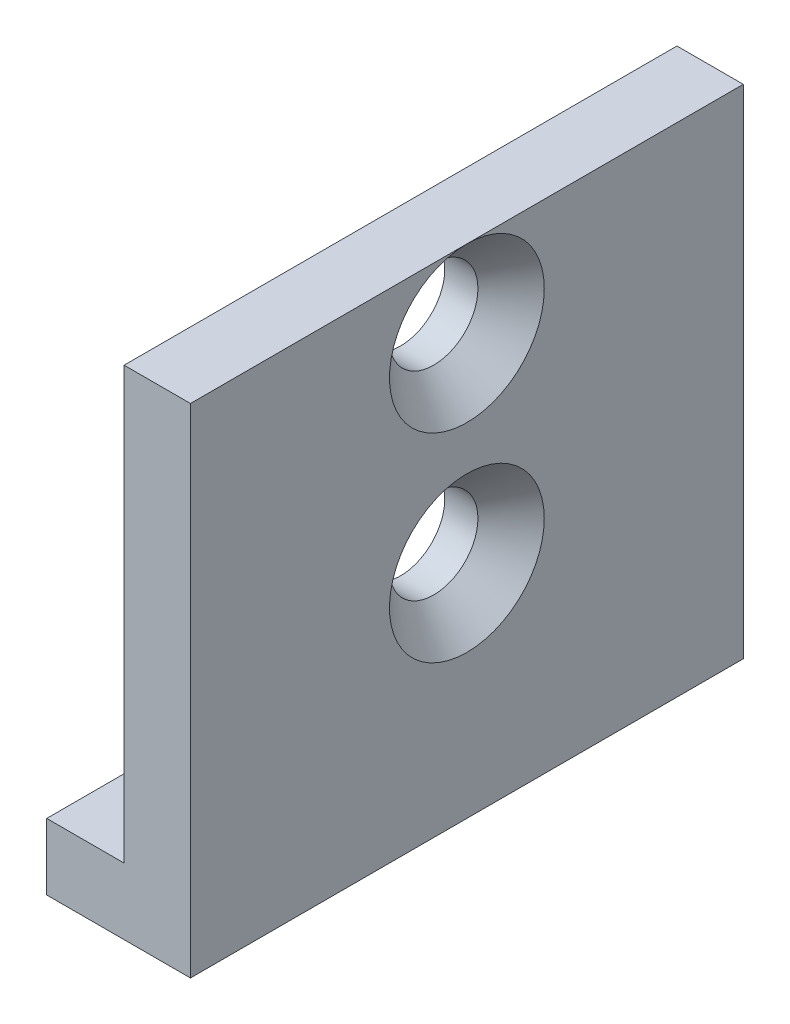
ISO-10303-21;
HEADER;
FILE_DESCRIPTION(('STEP AP214'),'2;1');
FILE_NAME('part.step','',(''),(''),'','','');
FILE_SCHEMA(('AUTOMOTIVE_DESIGN { 1 0 10303 214 1 1 1 1 }'));
ENDSEC;
DATA;
#1=APPLICATION_CONTEXT('core data for automotive mechanical design processes');
#2=APPLICATION_PROTOCOL_DEFINITION('international standard','automotive_design',2000,#1);
#3=PRODUCT_CONTEXT('',#1,'mechanical');
#4=PRODUCT('Part','Part','',(#3));
#5=PRODUCT_RELATED_PRODUCT_CATEGORY('part','',(#4));
#6=PRODUCT_DEFINITION_FORMATION('','',#4);
#7=PRODUCT_DEFINITION_CONTEXT('part definition',#1,'design');
#8=PRODUCT_DEFINITION('design','',#6,#7);
#9=PRODUCT_DEFINITION_SHAPE('','',#8);
#10=(LENGTH_UNIT() NAMED_UNIT(*) SI_UNIT(.MILLI.,.METRE.));
#11=(NAMED_UNIT(*) PLANE_ANGLE_UNIT() SI_UNIT($,.RADIAN.));
#12=(NAMED_UNIT(*) SI_UNIT($,.STERADIAN.) SOLID_ANGLE_UNIT());
#13=UNCERTAINTY_MEASURE_WITH_UNIT(LENGTH_MEASURE(1.E-05),#10,'distance_accuracy_value','');
#14=(GEOMETRIC_REPRESENTATION_CONTEXT(3) GLOBAL_UNCERTAINTY_ASSIGNED_CONTEXT((#13)) GLOBAL_UNIT_ASSIGNED_CONTEXT((#10,
#11,#12)) REPRESENTATION_CONTEXT('',''));
#15=CARTESIAN_POINT('',(0.,0.,0.));
#16=DIRECTION('',(0.,0.,1.));
#17=DIRECTION('',(1.,0.,0.));
#18=AXIS2_PLACEMENT_3D('',#15,#16,#17);
#19=CARTESIAN_POINT('',(-72.3656035851153,18.3861494768777,25.));
#20=DIRECTION('',(0.,1.,0.));
#21=DIRECTION('',(0.,0.,1.));
#22=AXIS2_PLACEMENT_3D('',#19,#20,#21);
#23=PLANE('',#22);
#24=DIRECTION('',(1.,0.,0.));
#25=VECTOR('',#24,1.);
#26=CARTESIAN_POINT('',(-72.3656035851153,18.3861494768777,-25.));
#27=LINE('',#26,#25);
#28=CARTESIAN_POINT('',(-72.3656035851153,18.3861494768777,-25.));
#29=VERTEX_POINT('',#28);
#30=CARTESIAN_POINT('',(-59.3656035851153,18.3861494768777,-25.));
#31=VERTEX_POINT('',#30);
#32=EDGE_CURVE('E139',#29,#31,#27,.T.);
#33=ORIENTED_EDGE('',*,*,#32,.T.);
#34=DIRECTION('',(0.,0.,-1.));
#35=VECTOR('',#34,1.);
#36=CARTESIAN_POINT('',(-59.3656035851153,18.3861494768777,25.));
#37=LINE('',#36,#35);
#38=CARTESIAN_POINT('',(-59.3656035851153,18.3861494768777,25.));
#39=VERTEX_POINT('',#38);
#40=EDGE_CURVE('E170',#39,#31,#37,.T.);
#41=ORIENTED_EDGE('',*,*,#40,.F.);
#42=DIRECTION('',(1.,0.,0.));
#43=VECTOR('',#42,1.);
#44=CARTESIAN_POINT('',(-72.3656035851153,18.3861494768777,25.));
#45=LINE('',#44,#43);
#46=CARTESIAN_POINT('',(-72.3656035851153,18.3861494768777,25.));
#47=VERTEX_POINT('',#46);
#48=EDGE_CURVE('E158',#47,#39,#45,.T.);
#49=ORIENTED_EDGE('',*,*,#48,.F.);
#50=DIRECTION('',(0.,0.,-1.));
#51=VECTOR('',#50,1.);
#52=CARTESIAN_POINT('',(-72.3656035851153,18.3861494768777,25.));
#53=LINE('',#52,#51);
#54=EDGE_CURVE('E135',#47,#29,#53,.T.);
#55=ORIENTED_EDGE('',*,*,#54,.T.);
#56=EDGE_LOOP('',(#33,#41,#49,#55));
#57=FACE_BOUND('',#56,.T.);
#58=ADVANCED_FACE('F43',(#57),#23,.F.);
#59=CARTESIAN_POINT('',(-59.3656035851153,18.3861494768777,25.));
#60=DIRECTION('',(-1.,0.,0.));
#61=DIRECTION('',(0.,-1.,0.));
#62=AXIS2_PLACEMENT_3D('',#59,#60,#61);
#63=PLANE('',#62);
#64=CARTESIAN_POINT('',(-59.3656035851153,38.3861494768777,0.));
#65=DIRECTION('',(-1.,0.,0.));
#66=DIRECTION('',(0.,-1.,0.));
#67=AXIS2_PLACEMENT_3D('',#64,#65,#66);
#68=CIRCLE('',#67,7.00000000000001);
#69=CARTESIAN_POINT('',(-59.3656035851153,31.3861494768777,0.));
#70=VERTEX_POINT('',#69);
#71=EDGE_CURVE('E177',#70,#70,#68,.T.);
#72=ORIENTED_EDGE('',*,*,#71,.T.);
#73=EDGE_LOOP('',(#72));
#74=FACE_BOUND('',#73,.T.);
#75=DIRECTION('',(0.,0.,-1.));
#76=VECTOR('',#75,1.);
#77=CARTESIAN_POINT('',(-59.3656035851153,63.3861494768777,25.));
#78=LINE('',#77,#76);
#79=CARTESIAN_POINT('',(-59.3656035851153,63.3861494768777,0.));
#80=VERTEX_POINT('',#79);
#81=CARTESIAN_POINT('',(-59.3656035851153,63.3861494768777,-25.));
#82=VERTEX_POINT('',#81);
#83=EDGE_CURVE('E165',#80,#82,#78,.T.);
#84=ORIENTED_EDGE('',*,*,#83,.F.);
#85=CARTESIAN_POINT('',(-59.3656035851153,56.3861494768777,0.));
#86=DIRECTION('',(-1.,0.,0.));
#87=DIRECTION('',(0.,-1.,0.));
#88=AXIS2_PLACEMENT_3D('',#85,#86,#87);
#89=CIRCLE('',#88,7.00000000000001);
#90=EDGE_CURVE('E53',#80,#80,#89,.T.);
#91=ORIENTED_EDGE('',*,*,#90,.T.);
#92=CARTESIAN_POINT('',(-59.3656035851153,63.3861494768777,25.));
#93=VERTEX_POINT('',#92);
#94=EDGE_CURVE('E166',#93,#80,#78,.T.);
#95=ORIENTED_EDGE('',*,*,#94,.F.);
#96=DIRECTION('',(0.,1.,0.));
#97=VECTOR('',#96,1.);
#98=CARTESIAN_POINT('',(-59.3656035851153,18.3861494768777,25.));
#99=LINE('',#98,#97);
#100=EDGE_CURVE('E100',#39,#93,#99,.T.);
#101=ORIENTED_EDGE('',*,*,#100,.F.);
#102=ORIENTED_EDGE('',*,*,#40,.T.);
#103=DIRECTION('',(0.,1.,0.));
#104=VECTOR('',#103,1.);
#105=CARTESIAN_POINT('',(-59.3656035851153,18.3861494768777,-25.));
#106=LINE('',#105,#104);
#107=EDGE_CURVE('E143',#31,#82,#106,.T.);
#108=ORIENTED_EDGE('',*,*,#107,.T.);
#109=EDGE_LOOP('',(#84,#91,#95,#101,#102,#108));
#110=FACE_BOUND('',#109,.T.);
#111=ADVANCED_FACE('F182',(#74,#110),#63,.F.);
#112=CARTESIAN_POINT('',(-59.3656035851153,63.3861494768777,25.));
#113=DIRECTION('',(0.,-1.,0.));
#114=DIRECTION('',(0.,0.,-1.));
#115=AXIS2_PLACEMENT_3D('',#112,#113,#114);
#116=PLANE('',#115);
#117=DIRECTION('',(-1.,0.,0.));
#118=VECTOR('',#117,1.);
#119=CARTESIAN_POINT('',(-59.3656035851153,63.3861494768777,-25.));
#120=LINE('',#119,#118);
#121=CARTESIAN_POINT('',(-65.3656035851153,63.3861494768777,-25.));
#122=VERTEX_POINT('',#121);
#123=EDGE_CURVE('E148',#82,#122,#120,.T.);
#124=ORIENTED_EDGE('',*,*,#123,.T.);
#125=DIRECTION('',(0.,0.,-1.));
#126=VECTOR('',#125,1.);
#127=CARTESIAN_POINT('',(-65.3656035851153,63.3861494768777,25.));
#128=LINE('',#127,#126);
#129=CARTESIAN_POINT('',(-65.3656035851153,63.3861494768777,25.));
#130=VERTEX_POINT('',#129);
#131=EDGE_CURVE('E128',#130,#122,#128,.T.);
#132=ORIENTED_EDGE('',*,*,#131,.F.);
#133=DIRECTION('',(-1.,0.,0.));
#134=VECTOR('',#133,1.);
#135=CARTESIAN_POINT('',(-59.3656035851153,63.3861494768777,25.));
#136=LINE('',#135,#134);
#137=EDGE_CURVE('E114',#93,#130,#136,.T.);
#138=ORIENTED_EDGE('',*,*,#137,.F.);
#139=ORIENTED_EDGE('',*,*,#94,.T.);
#140=ORIENTED_EDGE('',*,*,#83,.T.);
#141=EDGE_LOOP('',(#124,#132,#138,#139,#140));
#142=FACE_BOUND('',#141,.T.);
#143=ADVANCED_FACE('F186',(#142),#116,.F.);
#144=CARTESIAN_POINT('',(-65.3656035851153,63.3861494768777,25.));
#145=DIRECTION('',(1.,0.,0.));
#146=DIRECTION('',(0.,0.,-1.));
#147=AXIS2_PLACEMENT_3D('',#144,#145,#146);
#148=PLANE('',#147);
#149=CARTESIAN_POINT('',(-65.3656035851153,56.3861494768777,0.));
#150=DIRECTION('',(1.,0.,0.));
#151=DIRECTION('',(0.,0.,-1.));
#152=AXIS2_PLACEMENT_3D('',#149,#150,#151);
#153=CIRCLE('',#152,3.99999999999999);
#154=CARTESIAN_POINT('',(-65.3656035851153,56.3861494768777,-3.99999999999999));
#155=VERTEX_POINT('',#154);
#156=EDGE_CURVE('E196',#155,#155,#153,.T.);
#157=ORIENTED_EDGE('',*,*,#156,.T.);
#158=EDGE_LOOP('',(#157));
#159=FACE_BOUND('',#158,.T.);
#160=CARTESIAN_POINT('',(-65.3656035851153,38.3861494768777,0.));
#161=DIRECTION('',(1.,0.,0.));
#162=DIRECTION('',(0.,0.,-1.));
#163=AXIS2_PLACEMENT_3D('',#160,#161,#162);
#164=CIRCLE('',#163,3.99999999999999);
#165=CARTESIAN_POINT('',(-65.3656035851153,38.3861494768777,-3.99999999999999));
#166=VERTEX_POINT('',#165);
#167=EDGE_CURVE('E144',#166,#166,#164,.T.);
#168=ORIENTED_EDGE('',*,*,#167,.T.);
#169=EDGE_LOOP('',(#168));
#170=FACE_BOUND('',#169,.T.);
#171=DIRECTION('',(0.,-1.,0.));
#172=VECTOR('',#171,1.);
#173=CARTESIAN_POINT('',(-65.3656035851153,63.3861494768777,-25.));
#174=LINE('',#173,#172);
#175=CARTESIAN_POINT('',(-65.3656035851153,24.3861494768777,-25.));
#176=VERTEX_POINT('',#175);
#177=EDGE_CURVE('E124',#122,#176,#174,.T.);
#178=ORIENTED_EDGE('',*,*,#177,.T.);
#179=DIRECTION('',(0.,0.,-1.));
#180=VECTOR('',#179,1.);
#181=CARTESIAN_POINT('',(-65.3656035851153,24.3861494768777,25.));
#182=LINE('',#181,#180);
#183=CARTESIAN_POINT('',(-65.3656035851153,24.3861494768777,25.));
#184=VERTEX_POINT('',#183);
#185=EDGE_CURVE('E121',#184,#176,#182,.T.);
#186=ORIENTED_EDGE('',*,*,#185,.F.);
#187=DIRECTION('',(0.,-1.,0.));
#188=VECTOR('',#187,1.);
#189=CARTESIAN_POINT('',(-65.3656035851153,63.3861494768777,25.));
#190=LINE('',#189,#188);
#191=EDGE_CURVE('E107',#130,#184,#190,.T.);
#192=ORIENTED_EDGE('',*,*,#191,.F.);
#193=ORIENTED_EDGE('',*,*,#131,.T.);
#194=EDGE_LOOP('',(#178,#186,#192,#193));
#195=FACE_BOUND('',#194,.T.);
#196=ADVANCED_FACE('F122',(#159,#170,#195),#148,.F.);
#197=CARTESIAN_POINT('',(-65.3656035851153,24.3861494768777,25.));
#198=DIRECTION('',(0.,-1.,0.));
#199=DIRECTION('',(0.,0.,-1.));
#200=AXIS2_PLACEMENT_3D('',#197,#198,#199);
#201=PLANE('',#200);
#202=DIRECTION('',(-1.,0.,0.));
#203=VECTOR('',#202,1.);
#204=CARTESIAN_POINT('',(-65.3656035851153,24.3861494768777,-25.));
#205=LINE('',#204,#203);
#206=CARTESIAN_POINT('',(-72.3656035851153,24.3861494768777,-25.));
#207=VERTEX_POINT('',#206);
#208=EDGE_CURVE('E153',#176,#207,#205,.T.);
#209=ORIENTED_EDGE('',*,*,#208,.T.);
#210=DIRECTION('',(0.,0.,-1.));
#211=VECTOR('',#210,1.);
#212=CARTESIAN_POINT('',(-72.3656035851153,24.3861494768777,25.));
#213=LINE('',#212,#211);
#214=CARTESIAN_POINT('',(-72.3656035851153,24.3861494768777,25.));
#215=VERTEX_POINT('',#214);
#216=EDGE_CURVE('E129',#215,#207,#213,.T.);
#217=ORIENTED_EDGE('',*,*,#216,.F.);
#218=DIRECTION('',(-1.,0.,0.));
#219=VECTOR('',#218,1.);
#220=CARTESIAN_POINT('',(-65.3656035851153,24.3861494768777,25.));
#221=LINE('',#220,#219);
#222=EDGE_CURVE('E111',#184,#215,#221,.T.);
#223=ORIENTED_EDGE('',*,*,#222,.F.);
#224=ORIENTED_EDGE('',*,*,#185,.T.);
#225=EDGE_LOOP('',(#209,#217,#223,#224));
#226=FACE_BOUND('',#225,.T.);
#227=ADVANCED_FACE('F131',(#226),#201,.F.);
#228=CARTESIAN_POINT('',(-72.3656035851153,24.3861494768777,25.));
#229=DIRECTION('',(1.,0.,0.));
#230=DIRECTION('',(0.,0.,-1.));
#231=AXIS2_PLACEMENT_3D('',#228,#229,#230);
#232=PLANE('',#231);
#233=DIRECTION('',(0.,-1.,0.));
#234=VECTOR('',#233,1.);
#235=CARTESIAN_POINT('',(-72.3656035851153,24.3861494768777,-25.));
#236=LINE('',#235,#234);
#237=EDGE_CURVE('E91',#207,#29,#236,.T.);
#238=ORIENTED_EDGE('',*,*,#237,.T.);
#239=ORIENTED_EDGE('',*,*,#54,.F.);
#240=DIRECTION('',(0.,-1.,0.));
#241=VECTOR('',#240,1.);
#242=CARTESIAN_POINT('',(-72.3656035851153,24.3861494768777,25.));
#243=LINE('',#242,#241);
#244=EDGE_CURVE('E65',#215,#47,#243,.T.);
#245=ORIENTED_EDGE('',*,*,#244,.F.);
#246=ORIENTED_EDGE('',*,*,#216,.T.);
#247=EDGE_LOOP('',(#238,#239,#245,#246));
#248=FACE_BOUND('',#247,.T.);
#249=ADVANCED_FACE('F236',(#248),#232,.F.);
#250=CARTESIAN_POINT('',(0.,0.,25.));
#251=DIRECTION('',(0.,0.,1.));
#252=DIRECTION('',(1.,0.,0.));
#253=AXIS2_PLACEMENT_3D('',#250,#251,#252);
#254=PLANE('',#253);
#255=ORIENTED_EDGE('',*,*,#48,.T.);
#256=ORIENTED_EDGE('',*,*,#100,.T.);
#257=ORIENTED_EDGE('',*,*,#137,.T.);
#258=ORIENTED_EDGE('',*,*,#191,.T.);
#259=ORIENTED_EDGE('',*,*,#222,.T.);
#260=ORIENTED_EDGE('',*,*,#244,.T.);
#261=EDGE_LOOP('',(#255,#256,#257,#258,#259,#260));
#262=FACE_BOUND('',#261,.T.);
#263=ADVANCED_FACE('F109',(#262),#254,.T.);
#264=CARTESIAN_POINT('',(0.,0.,-25.));
#265=DIRECTION('',(0.,0.,1.));
#266=DIRECTION('',(1.,0.,0.));
#267=AXIS2_PLACEMENT_3D('',#264,#265,#266);
#268=PLANE('',#267);
#269=ORIENTED_EDGE('',*,*,#32,.F.);
#270=ORIENTED_EDGE('',*,*,#237,.F.);
#271=ORIENTED_EDGE('',*,*,#208,.F.);
#272=ORIENTED_EDGE('',*,*,#177,.F.);
#273=ORIENTED_EDGE('',*,*,#123,.F.);
#274=ORIENTED_EDGE('',*,*,#107,.F.);
#275=EDGE_LOOP('',(#269,#270,#271,#272,#273,#274));
#276=FACE_BOUND('',#275,.T.);
#277=ADVANCED_FACE('F213',(#276),#268,.F.);
#278=CARTESIAN_POINT('',(-59.3656035851153,38.3861494768777,0.));
#279=DIRECTION('',(1.,0.,0.));
#280=DIRECTION('',(0.,0.,-1.));
#281=AXIS2_PLACEMENT_3D('',#278,#279,#280);
#282=CYLINDRICAL_SURFACE('',#281,3.99999999999999);
#283=CARTESIAN_POINT('',(-62.3656035851153,38.3861494768777,0.));
#284=DIRECTION('',(-1.,0.,0.));
#285=DIRECTION('',(0.,0.,1.));
#286=AXIS2_PLACEMENT_3D('',#283,#284,#285);
#287=CIRCLE('',#286,3.99999999999999);
#288=CARTESIAN_POINT('',(-62.3656035851153,38.3861494768777,3.99999999999999));
#289=VERTEX_POINT('',#288);
#290=EDGE_CURVE('E11',#289,#289,#287,.F.);
#291=ORIENTED_EDGE('',*,*,#290,.T.);
#292=EDGE_LOOP('',(#291));
#293=FACE_BOUND('',#292,.T.);
#294=ORIENTED_EDGE('',*,*,#167,.F.);
#295=EDGE_LOOP('',(#294));
#296=FACE_BOUND('',#295,.T.);
#297=ADVANCED_FACE('F206',(#293,#296),#282,.F.);
#298=CARTESIAN_POINT('',(-59.3656035851153,56.3861494768777,0.));
#299=DIRECTION('',(1.,0.,0.));
#300=DIRECTION('',(0.,0.,-1.));
#301=AXIS2_PLACEMENT_3D('',#298,#299,#300);
#302=CYLINDRICAL_SURFACE('',#301,3.99999999999999);
#303=CARTESIAN_POINT('',(-62.3656035851153,56.3861494768777,0.));
#304=DIRECTION('',(-1.,0.,0.));
#305=DIRECTION('',(0.,0.,1.));
#306=AXIS2_PLACEMENT_3D('',#303,#304,#305);
#307=CIRCLE('',#306,3.99999999999999);
#308=CARTESIAN_POINT('',(-62.3656035851153,56.3861494768777,3.99999999999999));
#309=VERTEX_POINT('',#308);
#310=EDGE_CURVE('E173',#309,#309,#307,.F.);
#311=ORIENTED_EDGE('',*,*,#310,.T.);
#312=EDGE_LOOP('',(#311));
#313=FACE_BOUND('',#312,.T.);
#314=ORIENTED_EDGE('',*,*,#156,.F.);
#315=EDGE_LOOP('',(#314));
#316=FACE_BOUND('',#315,.T.);
#317=ADVANCED_FACE('F203',(#313,#316),#302,.F.);
#318=CARTESIAN_POINT('',(-62.3656035851153,56.3861494768777,0.));
#319=DIRECTION('',(1.,0.,0.));
#320=DIRECTION('',(0.,0.,-1.));
#321=AXIS2_PLACEMENT_3D('',#318,#319,#320);
#322=CONICAL_SURFACE('',#321,3.99999999999999,0.785398163397453);
#323=ORIENTED_EDGE('',*,*,#90,.F.);
#324=EDGE_LOOP('',(#323));
#325=FACE_BOUND('',#324,.T.);
#326=ORIENTED_EDGE('',*,*,#310,.F.);
#327=EDGE_LOOP('',(#326));
#328=FACE_BOUND('',#327,.T.);
#329=ADVANCED_FACE('F205',(#325,#328),#322,.F.);
#330=CARTESIAN_POINT('',(-62.3656035851153,38.3861494768777,0.));
#331=DIRECTION('',(1.,0.,0.));
#332=DIRECTION('',(0.,0.,-1.));
#333=AXIS2_PLACEMENT_3D('',#330,#331,#332);
#334=CONICAL_SURFACE('',#333,3.99999999999999,0.785398163397452);
#335=ORIENTED_EDGE('',*,*,#71,.F.);
#336=EDGE_LOOP('',(#335));
#337=FACE_BOUND('',#336,.T.);
#338=ORIENTED_EDGE('',*,*,#290,.F.);
#339=EDGE_LOOP('',(#338));
#340=FACE_BOUND('',#339,.T.);
#341=ADVANCED_FACE('F46',(#337,#340),#334,.F.);
#342=CLOSED_SHELL('',(#58,#111,#143,#196,#227,#249,#263,#277,#297,#317,#329,#341));
#343=MANIFOLD_SOLID_BREP('B2',#342);
#344=ADVANCED_BREP_SHAPE_REPRESENTATION('',(#18,#343),#14);
#345=SHAPE_DEFINITION_REPRESENTATION(#9,#344);
ENDSEC;
END-ISO-10303-21;
